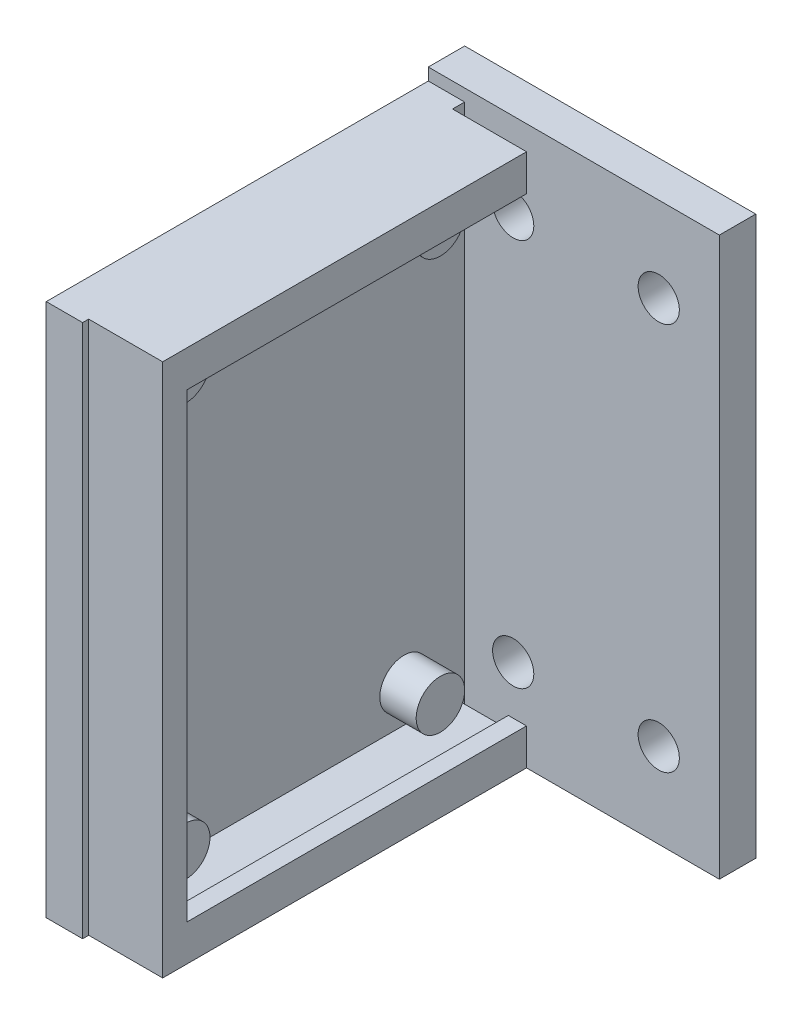
ISO-10303-21;
HEADER;
FILE_DESCRIPTION(('STEP AP214'),'2;1');
FILE_NAME('part.step','',(''),(''),'','','');
FILE_SCHEMA(('AUTOMOTIVE_DESIGN { 1 0 10303 214 1 1 1 1 }'));
ENDSEC;
DATA;
#1=APPLICATION_CONTEXT('core data for automotive mechanical design processes');
#2=APPLICATION_PROTOCOL_DEFINITION('international standard','automotive_design',2000,#1);
#3=PRODUCT_CONTEXT('',#1,'mechanical');
#4=PRODUCT('Part','Part','',(#3));
#5=PRODUCT_RELATED_PRODUCT_CATEGORY('part','',(#4));
#6=PRODUCT_DEFINITION_FORMATION('','',#4);
#7=PRODUCT_DEFINITION_CONTEXT('part definition',#1,'design');
#8=PRODUCT_DEFINITION('design','',#6,#7);
#9=PRODUCT_DEFINITION_SHAPE('','',#8);
#10=(LENGTH_UNIT() NAMED_UNIT(*) SI_UNIT(.MILLI.,.METRE.));
#11=(NAMED_UNIT(*) PLANE_ANGLE_UNIT() SI_UNIT($,.RADIAN.));
#12=(NAMED_UNIT(*) SI_UNIT($,.STERADIAN.) SOLID_ANGLE_UNIT());
#13=UNCERTAINTY_MEASURE_WITH_UNIT(LENGTH_MEASURE(1.E-05),#10,'distance_accuracy_value','');
#14=(GEOMETRIC_REPRESENTATION_CONTEXT(3) GLOBAL_UNCERTAINTY_ASSIGNED_CONTEXT((#13)) GLOBAL_UNIT_ASSIGNED_CONTEXT((#10,
#11,#12)) REPRESENTATION_CONTEXT('',''));
#15=CARTESIAN_POINT('',(0.,0.,0.));
#16=DIRECTION('',(0.,0.,1.));
#17=DIRECTION('',(1.,0.,0.));
#18=AXIS2_PLACEMENT_3D('',#15,#16,#17);
#19=CARTESIAN_POINT('',(181.,-22.,146.));
#20=DIRECTION('',(-1.,0.,0.));
#21=DIRECTION('',(0.,0.,1.));
#22=AXIS2_PLACEMENT_3D('',#19,#20,#21);
#23=PLANE('',#22);
#24=DIRECTION('',(0.,-1.,0.));
#25=VECTOR('',#24,1.);
#26=CARTESIAN_POINT('',(181.,-20.,145.5));
#27=LINE('',#26,#25);
#28=CARTESIAN_POINT('',(181.,22.,145.5));
#29=VERTEX_POINT('',#28);
#30=CARTESIAN_POINT('',(181.,-22.,145.5));
#31=VERTEX_POINT('',#30);
#32=EDGE_CURVE('E266',#29,#31,#27,.T.);
#33=ORIENTED_EDGE('',*,*,#32,.F.);
#34=DIRECTION('',(0.,0.,-1.));
#35=VECTOR('',#34,1.);
#36=CARTESIAN_POINT('',(181.,22.,146.));
#37=LINE('',#36,#35);
#38=CARTESIAN_POINT('',(181.,22.,146.));
#39=VERTEX_POINT('',#38);
#40=EDGE_CURVE('E344',#39,#29,#37,.T.);
#41=ORIENTED_EDGE('',*,*,#40,.F.);
#42=DIRECTION('',(0.,1.,0.));
#43=VECTOR('',#42,1.);
#44=CARTESIAN_POINT('',(181.,-22.,146.));
#45=LINE('',#44,#43);
#46=CARTESIAN_POINT('',(181.,-22.,146.));
#47=VERTEX_POINT('',#46);
#48=EDGE_CURVE('E329',#47,#39,#45,.T.);
#49=ORIENTED_EDGE('',*,*,#48,.F.);
#50=DIRECTION('',(0.,0.,-1.));
#51=VECTOR('',#50,1.);
#52=CARTESIAN_POINT('',(181.,-22.,146.));
#53=LINE('',#52,#51);
#54=EDGE_CURVE('E349',#47,#31,#53,.T.);
#55=ORIENTED_EDGE('',*,*,#54,.T.);
#56=EDGE_LOOP('',(#33,#41,#49,#55));
#57=FACE_BOUND('',#56,.T.);
#58=ADVANCED_FACE('F41',(#57),#23,.F.);
#59=CARTESIAN_POINT('',(185.6,20.,145.5));
#60=DIRECTION('',(1.,0.,0.));
#61=DIRECTION('',(0.,0.,-1.));
#62=AXIS2_PLACEMENT_3D('',#59,#60,#61);
#63=PLANE('',#62);
#64=DIRECTION('',(0.,-1.,0.));
#65=VECTOR('',#64,1.);
#66=CARTESIAN_POINT('',(185.6,20.,143.5));
#67=LINE('',#66,#65);
#68=CARTESIAN_POINT('',(185.6,20.,143.5));
#69=VERTEX_POINT('',#68);
#70=CARTESIAN_POINT('',(185.6,19.,143.5));
#71=VERTEX_POINT('',#70);
#72=EDGE_CURVE('E265',#69,#71,#67,.T.);
#73=ORIENTED_EDGE('',*,*,#72,.F.);
#74=DIRECTION('',(0.,0.,-1.));
#75=VECTOR('',#74,1.);
#76=CARTESIAN_POINT('',(185.6,20.,145.5));
#77=LINE('',#76,#75);
#78=CARTESIAN_POINT('',(185.6,20.,115.5));
#79=VERTEX_POINT('',#78);
#80=EDGE_CURVE('E298',#69,#79,#77,.T.);
#81=ORIENTED_EDGE('',*,*,#80,.T.);
#82=DIRECTION('',(0.,-1.,0.));
#83=VECTOR('',#82,1.);
#84=CARTESIAN_POINT('',(185.6,20.,115.5));
#85=LINE('',#84,#83);
#86=CARTESIAN_POINT('',(185.6,19.,115.5));
#87=VERTEX_POINT('',#86);
#88=EDGE_CURVE('E314',#79,#87,#85,.T.);
#89=ORIENTED_EDGE('',*,*,#88,.T.);
#90=DIRECTION('',(0.,0.,-1.));
#91=VECTOR('',#90,1.);
#92=CARTESIAN_POINT('',(185.6,19.,145.5));
#93=LINE('',#92,#91);
#94=EDGE_CURVE('E296',#71,#87,#93,.T.);
#95=ORIENTED_EDGE('',*,*,#94,.F.);
#96=EDGE_LOOP('',(#73,#81,#89,#95));
#97=FACE_BOUND('',#96,.T.);
#98=ADVANCED_FACE('F422',(#97),#63,.F.);
#99=CARTESIAN_POINT('',(185.6,19.,145.5));
#100=DIRECTION('',(0.,1.,0.));
#101=DIRECTION('',(0.,0.,1.));
#102=AXIS2_PLACEMENT_3D('',#99,#100,#101);
#103=PLANE('',#102);
#104=DIRECTION('',(1.,0.,0.));
#105=VECTOR('',#104,1.);
#106=CARTESIAN_POINT('',(185.6,19.,143.5));
#107=LINE('',#106,#105);
#108=CARTESIAN_POINT('',(187.1,19.,143.5));
#109=VERTEX_POINT('',#108);
#110=EDGE_CURVE('E259',#71,#109,#107,.T.);
#111=ORIENTED_EDGE('',*,*,#110,.F.);
#112=ORIENTED_EDGE('',*,*,#94,.T.);
#113=DIRECTION('',(1.,0.,0.));
#114=VECTOR('',#113,1.);
#115=CARTESIAN_POINT('',(185.6,19.,115.5));
#116=LINE('',#115,#114);
#117=CARTESIAN_POINT('',(187.1,19.,115.5));
#118=VERTEX_POINT('',#117);
#119=EDGE_CURVE('E313',#87,#118,#116,.T.);
#120=ORIENTED_EDGE('',*,*,#119,.T.);
#121=DIRECTION('',(0.,0.,-1.));
#122=VECTOR('',#121,1.);
#123=CARTESIAN_POINT('',(187.1,19.,145.5));
#124=LINE('',#123,#122);
#125=EDGE_CURVE('E299',#109,#118,#124,.T.);
#126=ORIENTED_EDGE('',*,*,#125,.F.);
#127=EDGE_LOOP('',(#111,#112,#120,#126));
#128=FACE_BOUND('',#127,.T.);
#129=ADVANCED_FACE('F435',(#128),#103,.F.);
#130=CARTESIAN_POINT('',(187.1,-19.,145.5));
#131=DIRECTION('',(0.,-1.,0.));
#132=DIRECTION('',(0.,0.,-1.));
#133=AXIS2_PLACEMENT_3D('',#130,#131,#132);
#134=PLANE('',#133);
#135=DIRECTION('',(-1.,0.,0.));
#136=VECTOR('',#135,1.);
#137=CARTESIAN_POINT('',(187.1,-19.,143.5));
#138=LINE('',#137,#136);
#139=CARTESIAN_POINT('',(187.1,-19.,143.5));
#140=VERTEX_POINT('',#139);
#141=CARTESIAN_POINT('',(185.6,-19.,143.5));
#142=VERTEX_POINT('',#141);
#143=EDGE_CURVE('E201',#140,#142,#138,.T.);
#144=ORIENTED_EDGE('',*,*,#143,.F.);
#145=DIRECTION('',(0.,0.,-1.));
#146=VECTOR('',#145,1.);
#147=CARTESIAN_POINT('',(187.1,-19.,145.5));
#148=LINE('',#147,#146);
#149=CARTESIAN_POINT('',(187.1,-19.,115.5));
#150=VERTEX_POINT('',#149);
#151=EDGE_CURVE('E288',#140,#150,#148,.T.);
#152=ORIENTED_EDGE('',*,*,#151,.T.);
#153=DIRECTION('',(-1.,0.,0.));
#154=VECTOR('',#153,1.);
#155=CARTESIAN_POINT('',(187.1,-19.,115.5));
#156=LINE('',#155,#154);
#157=CARTESIAN_POINT('',(185.6,-19.,115.5));
#158=VERTEX_POINT('',#157);
#159=EDGE_CURVE('E285',#150,#158,#156,.T.);
#160=ORIENTED_EDGE('',*,*,#159,.T.);
#161=DIRECTION('',(0.,0.,-1.));
#162=VECTOR('',#161,1.);
#163=CARTESIAN_POINT('',(185.6,-19.,145.5));
#164=LINE('',#163,#162);
#165=EDGE_CURVE('E191',#142,#158,#164,.T.);
#166=ORIENTED_EDGE('',*,*,#165,.F.);
#167=EDGE_LOOP('',(#144,#152,#160,#166));
#168=FACE_BOUND('',#167,.T.);
#169=ADVANCED_FACE('F477',(#168),#134,.F.);
#170=CARTESIAN_POINT('',(185.6,-19.,145.5));
#171=DIRECTION('',(1.,0.,0.));
#172=DIRECTION('',(0.,0.,-1.));
#173=AXIS2_PLACEMENT_3D('',#170,#171,#172);
#174=PLANE('',#173);
#175=DIRECTION('',(0.,-1.,0.));
#176=VECTOR('',#175,1.);
#177=CARTESIAN_POINT('',(185.6,-19.,143.5));
#178=LINE('',#177,#176);
#179=CARTESIAN_POINT('',(185.6,-20.,143.5));
#180=VERTEX_POINT('',#179);
#181=EDGE_CURVE('E184',#142,#180,#178,.T.);
#182=ORIENTED_EDGE('',*,*,#181,.F.);
#183=ORIENTED_EDGE('',*,*,#165,.T.);
#184=DIRECTION('',(0.,-1.,0.));
#185=VECTOR('',#184,1.);
#186=CARTESIAN_POINT('',(185.6,-19.,115.5));
#187=LINE('',#186,#185);
#188=CARTESIAN_POINT('',(185.6,-20.,115.5));
#189=VERTEX_POINT('',#188);
#190=EDGE_CURVE('E190',#158,#189,#187,.T.);
#191=ORIENTED_EDGE('',*,*,#190,.T.);
#192=DIRECTION('',(0.,0.,-1.));
#193=VECTOR('',#192,1.);
#194=CARTESIAN_POINT('',(185.6,-20.,145.5));
#195=LINE('',#194,#193);
#196=EDGE_CURVE('E179',#180,#189,#195,.T.);
#197=ORIENTED_EDGE('',*,*,#196,.F.);
#198=EDGE_LOOP('',(#182,#183,#191,#197));
#199=FACE_BOUND('',#198,.T.);
#200=ADVANCED_FACE('F185',(#199),#174,.F.);
#201=CARTESIAN_POINT('',(178.,23.,114.5));
#202=DIRECTION('',(1.,0.,0.));
#203=DIRECTION('',(0.,0.,-1.));
#204=AXIS2_PLACEMENT_3D('',#201,#202,#203);
#205=PLANE('',#204);
#206=DIRECTION('',(0.,-1.,0.));
#207=VECTOR('',#206,1.);
#208=CARTESIAN_POINT('',(178.,23.,111.5));
#209=LINE('',#208,#207);
#210=CARTESIAN_POINT('',(178.,23.,111.5));
#211=VERTEX_POINT('',#210);
#212=CARTESIAN_POINT('',(178.,-23.,111.5));
#213=VERTEX_POINT('',#212);
#214=EDGE_CURVE('E352',#211,#213,#209,.T.);
#215=ORIENTED_EDGE('',*,*,#214,.T.);
#216=DIRECTION('',(0.,0.,-1.));
#217=VECTOR('',#216,1.);
#218=CARTESIAN_POINT('',(178.,-23.,114.5));
#219=LINE('',#218,#217);
#220=CARTESIAN_POINT('',(178.,-23.,114.5));
#221=VERTEX_POINT('',#220);
#222=EDGE_CURVE('E202',#221,#213,#219,.T.);
#223=ORIENTED_EDGE('',*,*,#222,.F.);
#224=DIRECTION('',(0.,-1.,0.));
#225=VECTOR('',#224,1.);
#226=CARTESIAN_POINT('',(178.,23.,114.5));
#227=LINE('',#226,#225);
#228=CARTESIAN_POINT('',(178.,-22.,114.5));
#229=VERTEX_POINT('',#228);
#230=EDGE_CURVE('E357',#229,#221,#227,.T.);
#231=ORIENTED_EDGE('',*,*,#230,.F.);
#232=DIRECTION('',(0.,0.,-1.));
#233=VECTOR('',#232,1.);
#234=CARTESIAN_POINT('',(178.,-22.,146.));
#235=LINE('',#234,#233);
#236=CARTESIAN_POINT('',(178.,-22.,146.));
#237=VERTEX_POINT('',#236);
#238=EDGE_CURVE('E353',#237,#229,#235,.T.);
#239=ORIENTED_EDGE('',*,*,#238,.F.);
#240=DIRECTION('',(0.,-1.,0.));
#241=VECTOR('',#240,1.);
#242=CARTESIAN_POINT('',(178.,22.,146.));
#243=LINE('',#242,#241);
#244=CARTESIAN_POINT('',(178.,22.,146.));
#245=VERTEX_POINT('',#244);
#246=EDGE_CURVE('E322',#245,#237,#243,.T.);
#247=ORIENTED_EDGE('',*,*,#246,.F.);
#248=DIRECTION('',(0.,0.,-1.));
#249=VECTOR('',#248,1.);
#250=CARTESIAN_POINT('',(178.,22.,146.));
#251=LINE('',#250,#249);
#252=CARTESIAN_POINT('',(178.,22.,114.5));
#253=VERTEX_POINT('',#252);
#254=EDGE_CURVE('E331',#245,#253,#251,.T.);
#255=ORIENTED_EDGE('',*,*,#254,.T.);
#256=CARTESIAN_POINT('',(178.,23.,114.5));
#257=VERTEX_POINT('',#256);
#258=EDGE_CURVE('E354',#257,#253,#227,.T.);
#259=ORIENTED_EDGE('',*,*,#258,.F.);
#260=DIRECTION('',(0.,0.,-1.));
#261=VECTOR('',#260,1.);
#262=CARTESIAN_POINT('',(178.,23.,114.5));
#263=LINE('',#262,#261);
#264=EDGE_CURVE('E365',#257,#211,#263,.T.);
#265=ORIENTED_EDGE('',*,*,#264,.T.);
#266=EDGE_LOOP('',(#215,#223,#231,#239,#247,#255,#259,#265));
#267=FACE_BOUND('',#266,.T.);
#268=ADVANCED_FACE('F43',(#267),#205,.F.);
#269=CARTESIAN_POINT('',(178.,-23.,114.5));
#270=DIRECTION('',(0.,1.,0.));
#271=DIRECTION('',(0.,0.,1.));
#272=AXIS2_PLACEMENT_3D('',#269,#270,#271);
#273=PLANE('',#272);
#274=DIRECTION('',(1.,0.,0.));
#275=VECTOR('',#274,1.);
#276=CARTESIAN_POINT('',(178.,-23.,111.5));
#277=LINE('',#276,#275);
#278=CARTESIAN_POINT('',(202.,-23.,111.5));
#279=VERTEX_POINT('',#278);
#280=EDGE_CURVE('E370',#213,#279,#277,.T.);
#281=ORIENTED_EDGE('',*,*,#280,.T.);
#282=DIRECTION('',(0.,0.,-1.));
#283=VECTOR('',#282,1.);
#284=CARTESIAN_POINT('',(202.,-23.,114.5));
#285=LINE('',#284,#283);
#286=CARTESIAN_POINT('',(202.,-23.,114.5));
#287=VERTEX_POINT('',#286);
#288=EDGE_CURVE('E211',#287,#279,#285,.T.);
#289=ORIENTED_EDGE('',*,*,#288,.F.);
#290=DIRECTION('',(1.,0.,0.));
#291=VECTOR('',#290,1.);
#292=CARTESIAN_POINT('',(178.,-23.,114.5));
#293=LINE('',#292,#291);
#294=EDGE_CURVE('E360',#221,#287,#293,.T.);
#295=ORIENTED_EDGE('',*,*,#294,.F.);
#296=ORIENTED_EDGE('',*,*,#222,.T.);
#297=EDGE_LOOP('',(#281,#289,#295,#296));
#298=FACE_BOUND('',#297,.T.);
#299=ADVANCED_FACE('F417',(#298),#273,.F.);
#300=CARTESIAN_POINT('',(202.,-23.,114.5));
#301=DIRECTION('',(-1.,0.,0.));
#302=DIRECTION('',(0.,0.,1.));
#303=AXIS2_PLACEMENT_3D('',#300,#301,#302);
#304=PLANE('',#303);
#305=DIRECTION('',(0.,1.,0.));
#306=VECTOR('',#305,1.);
#307=CARTESIAN_POINT('',(202.,-23.,111.5));
#308=LINE('',#307,#306);
#309=CARTESIAN_POINT('',(202.,23.,111.5));
#310=VERTEX_POINT('',#309);
#311=EDGE_CURVE('E369',#279,#310,#308,.T.);
#312=ORIENTED_EDGE('',*,*,#311,.T.);
#313=DIRECTION('',(0.,0.,-1.));
#314=VECTOR('',#313,1.);
#315=CARTESIAN_POINT('',(202.,23.,114.5));
#316=LINE('',#315,#314);
#317=CARTESIAN_POINT('',(202.,23.,114.5));
#318=VERTEX_POINT('',#317);
#319=EDGE_CURVE('E374',#318,#310,#316,.T.);
#320=ORIENTED_EDGE('',*,*,#319,.F.);
#321=DIRECTION('',(0.,1.,0.));
#322=VECTOR('',#321,1.);
#323=CARTESIAN_POINT('',(202.,-23.,114.5));
#324=LINE('',#323,#322);
#325=EDGE_CURVE('E359',#287,#318,#324,.T.);
#326=ORIENTED_EDGE('',*,*,#325,.F.);
#327=ORIENTED_EDGE('',*,*,#288,.T.);
#328=EDGE_LOOP('',(#312,#320,#326,#327));
#329=FACE_BOUND('',#328,.T.);
#330=ADVANCED_FACE('F385',(#329),#304,.F.);
#331=CARTESIAN_POINT('',(202.,23.,114.5));
#332=DIRECTION('',(0.,-1.,0.));
#333=DIRECTION('',(0.,0.,-1.));
#334=AXIS2_PLACEMENT_3D('',#331,#332,#333);
#335=PLANE('',#334);
#336=DIRECTION('',(-1.,0.,0.));
#337=VECTOR('',#336,1.);
#338=CARTESIAN_POINT('',(202.,23.,111.5));
#339=LINE('',#338,#337);
#340=EDGE_CURVE('E371',#310,#211,#339,.T.);
#341=ORIENTED_EDGE('',*,*,#340,.T.);
#342=ORIENTED_EDGE('',*,*,#264,.F.);
#343=DIRECTION('',(-1.,0.,0.));
#344=VECTOR('',#343,1.);
#345=CARTESIAN_POINT('',(202.,23.,114.5));
#346=LINE('',#345,#344);
#347=EDGE_CURVE('E362',#318,#257,#346,.T.);
#348=ORIENTED_EDGE('',*,*,#347,.F.);
#349=ORIENTED_EDGE('',*,*,#319,.T.);
#350=EDGE_LOOP('',(#341,#342,#348,#349));
#351=FACE_BOUND('',#350,.T.);
#352=ADVANCED_FACE('F395',(#351),#335,.F.);
#353=CARTESIAN_POINT('',(0.,0.,114.5));
#354=DIRECTION('',(0.,0.,1.));
#355=DIRECTION('',(1.,0.,0.));
#356=AXIS2_PLACEMENT_3D('',#353,#354,#355);
#357=PLANE('',#356);
#358=CARTESIAN_POINT('',(185.,16.,114.5));
#359=DIRECTION('',(0.,0.,1.));
#360=DIRECTION('',(1.,0.,0.));
#361=AXIS2_PLACEMENT_3D('',#358,#359,#360);
#362=CIRCLE('',#361,1.70000000000001);
#363=CARTESIAN_POINT('',(186.7,16.,114.5));
#364=VERTEX_POINT('',#363);
#365=EDGE_CURVE('E239',#364,#364,#362,.F.);
#366=ORIENTED_EDGE('',*,*,#365,.T.);
#367=EDGE_LOOP('',(#366));
#368=FACE_BOUND('',#367,.T.);
#369=CARTESIAN_POINT('',(197.,-16.,114.5));
#370=DIRECTION('',(0.,0.,1.));
#371=DIRECTION('',(1.,0.,0.));
#372=AXIS2_PLACEMENT_3D('',#369,#370,#371);
#373=CIRCLE('',#372,1.70000000000001);
#374=CARTESIAN_POINT('',(198.7,-16.,114.5));
#375=VERTEX_POINT('',#374);
#376=EDGE_CURVE('E226',#375,#375,#373,.F.);
#377=ORIENTED_EDGE('',*,*,#376,.T.);
#378=EDGE_LOOP('',(#377));
#379=FACE_BOUND('',#378,.T.);
#380=CARTESIAN_POINT('',(197.,16.,114.5));
#381=DIRECTION('',(0.,0.,1.));
#382=DIRECTION('',(1.,0.,0.));
#383=AXIS2_PLACEMENT_3D('',#380,#381,#382);
#384=CIRCLE('',#383,1.70000000000001);
#385=CARTESIAN_POINT('',(198.7,16.,114.5));
#386=VERTEX_POINT('',#385);
#387=EDGE_CURVE('E223',#386,#386,#384,.F.);
#388=ORIENTED_EDGE('',*,*,#387,.T.);
#389=EDGE_LOOP('',(#388));
#390=FACE_BOUND('',#389,.T.);
#391=CARTESIAN_POINT('',(185.,-16.,114.5));
#392=DIRECTION('',(0.,0.,1.));
#393=DIRECTION('',(1.,0.,0.));
#394=AXIS2_PLACEMENT_3D('',#391,#392,#393);
#395=CIRCLE('',#394,1.70000000000001);
#396=CARTESIAN_POINT('',(186.7,-16.,114.5));
#397=VERTEX_POINT('',#396);
#398=EDGE_CURVE('E225',#397,#397,#395,.F.);
#399=ORIENTED_EDGE('',*,*,#398,.T.);
#400=EDGE_LOOP('',(#399));
#401=FACE_BOUND('',#400,.T.);
#402=DIRECTION('',(-1.,0.,0.));
#403=VECTOR('',#402,1.);
#404=CARTESIAN_POINT('',(181.,22.,114.5));
#405=LINE('',#404,#403);
#406=CARTESIAN_POINT('',(181.,22.,114.5));
#407=VERTEX_POINT('',#406);
#408=EDGE_CURVE('E327',#407,#253,#405,.T.);
#409=ORIENTED_EDGE('',*,*,#408,.F.);
#410=DIRECTION('',(0.,1.,0.));
#411=VECTOR('',#410,1.);
#412=CARTESIAN_POINT('',(181.,-22.,114.5));
#413=LINE('',#412,#411);
#414=CARTESIAN_POINT('',(181.,-22.,114.5));
#415=VERTEX_POINT('',#414);
#416=EDGE_CURVE('E340',#415,#407,#413,.T.);
#417=ORIENTED_EDGE('',*,*,#416,.F.);
#418=DIRECTION('',(1.,0.,0.));
#419=VECTOR('',#418,1.);
#420=CARTESIAN_POINT('',(178.,-22.,114.5));
#421=LINE('',#420,#419);
#422=EDGE_CURVE('E294',#229,#415,#421,.T.);
#423=ORIENTED_EDGE('',*,*,#422,.F.);
#424=ORIENTED_EDGE('',*,*,#230,.T.);
#425=ORIENTED_EDGE('',*,*,#294,.T.);
#426=ORIENTED_EDGE('',*,*,#325,.T.);
#427=ORIENTED_EDGE('',*,*,#347,.T.);
#428=ORIENTED_EDGE('',*,*,#258,.T.);
#429=EDGE_LOOP('',(#409,#417,#423,#424,#425,#426,#427,#428));
#430=FACE_BOUND('',#429,.T.);
#431=ADVANCED_FACE('F402',(#368,#379,#390,#401,#430),#357,.T.);
#432=CARTESIAN_POINT('',(0.,0.,111.5));
#433=DIRECTION('',(0.,0.,1.));
#434=DIRECTION('',(1.,0.,0.));
#435=AXIS2_PLACEMENT_3D('',#432,#433,#434);
#436=PLANE('',#435);
#437=CARTESIAN_POINT('',(185.,16.,111.5));
#438=DIRECTION('',(0.,0.,1.));
#439=DIRECTION('',(1.,0.,0.));
#440=AXIS2_PLACEMENT_3D('',#437,#438,#439);
#441=CIRCLE('',#440,1.70000000000001);
#442=CARTESIAN_POINT('',(186.7,16.,111.5));
#443=VERTEX_POINT('',#442);
#444=EDGE_CURVE('E44',#443,#443,#441,.F.);
#445=ORIENTED_EDGE('',*,*,#444,.F.);
#446=EDGE_LOOP('',(#445));
#447=FACE_BOUND('',#446,.T.);
#448=CARTESIAN_POINT('',(197.,-16.,111.5));
#449=DIRECTION('',(0.,0.,1.));
#450=DIRECTION('',(1.,0.,0.));
#451=AXIS2_PLACEMENT_3D('',#448,#449,#450);
#452=CIRCLE('',#451,1.70000000000001);
#453=CARTESIAN_POINT('',(198.7,-16.,111.5));
#454=VERTEX_POINT('',#453);
#455=EDGE_CURVE('E228',#454,#454,#452,.F.);
#456=ORIENTED_EDGE('',*,*,#455,.F.);
#457=EDGE_LOOP('',(#456));
#458=FACE_BOUND('',#457,.T.);
#459=CARTESIAN_POINT('',(197.,16.,111.5));
#460=DIRECTION('',(0.,0.,1.));
#461=DIRECTION('',(1.,0.,0.));
#462=AXIS2_PLACEMENT_3D('',#459,#460,#461);
#463=CIRCLE('',#462,1.70000000000001);
#464=CARTESIAN_POINT('',(198.7,16.,111.5));
#465=VERTEX_POINT('',#464);
#466=EDGE_CURVE('E224',#465,#465,#463,.F.);
#467=ORIENTED_EDGE('',*,*,#466,.F.);
#468=EDGE_LOOP('',(#467));
#469=FACE_BOUND('',#468,.T.);
#470=CARTESIAN_POINT('',(185.,-16.,111.5));
#471=DIRECTION('',(0.,0.,1.));
#472=DIRECTION('',(1.,0.,0.));
#473=AXIS2_PLACEMENT_3D('',#470,#471,#472);
#474=CIRCLE('',#473,1.70000000000001);
#475=CARTESIAN_POINT('',(186.7,-16.,111.5));
#476=VERTEX_POINT('',#475);
#477=EDGE_CURVE('E218',#476,#476,#474,.F.);
#478=ORIENTED_EDGE('',*,*,#477,.F.);
#479=EDGE_LOOP('',(#478));
#480=FACE_BOUND('',#479,.T.);
#481=ORIENTED_EDGE('',*,*,#214,.F.);
#482=ORIENTED_EDGE('',*,*,#340,.F.);
#483=ORIENTED_EDGE('',*,*,#311,.F.);
#484=ORIENTED_EDGE('',*,*,#280,.F.);
#485=EDGE_LOOP('',(#481,#482,#483,#484));
#486=FACE_BOUND('',#485,.T.);
#487=ADVANCED_FACE('F386',(#447,#458,#469,#480,#486),#436,.F.);
#488=CARTESIAN_POINT('',(178.,-22.,146.));
#489=DIRECTION('',(0.,1.,0.));
#490=DIRECTION('',(0.,0.,1.));
#491=AXIS2_PLACEMENT_3D('',#488,#489,#490);
#492=PLANE('',#491);
#493=ORIENTED_EDGE('',*,*,#422,.T.);
#494=CARTESIAN_POINT('',(181.,-22.,115.5));
#495=VERTEX_POINT('',#494);
#496=EDGE_CURVE('E346',#495,#415,#53,.T.);
#497=ORIENTED_EDGE('',*,*,#496,.F.);
#498=DIRECTION('',(1.,0.,0.));
#499=VECTOR('',#498,1.);
#500=CARTESIAN_POINT('',(181.,-22.,115.5));
#501=LINE('',#500,#499);
#502=CARTESIAN_POINT('',(187.1,-22.,115.5));
#503=VERTEX_POINT('',#502);
#504=EDGE_CURVE('E277',#495,#503,#501,.T.);
#505=ORIENTED_EDGE('',*,*,#504,.T.);
#506=DIRECTION('',(0.,0.,-1.));
#507=VECTOR('',#506,1.);
#508=CARTESIAN_POINT('',(187.1,-22.,145.5));
#509=LINE('',#508,#507);
#510=CARTESIAN_POINT('',(187.1,-22.,145.5));
#511=VERTEX_POINT('',#510);
#512=EDGE_CURVE('E292',#511,#503,#509,.T.);
#513=ORIENTED_EDGE('',*,*,#512,.F.);
#514=DIRECTION('',(1.,0.,0.));
#515=VECTOR('',#514,1.);
#516=CARTESIAN_POINT('',(181.,-22.,145.5));
#517=LINE('',#516,#515);
#518=EDGE_CURVE('E267',#31,#511,#517,.T.);
#519=ORIENTED_EDGE('',*,*,#518,.F.);
#520=ORIENTED_EDGE('',*,*,#54,.F.);
#521=DIRECTION('',(1.,0.,0.));
#522=VECTOR('',#521,1.);
#523=CARTESIAN_POINT('',(178.,-22.,146.));
#524=LINE('',#523,#522);
#525=EDGE_CURVE('E330',#237,#47,#524,.T.);
#526=ORIENTED_EDGE('',*,*,#525,.F.);
#527=ORIENTED_EDGE('',*,*,#238,.T.);
#528=EDGE_LOOP('',(#493,#497,#505,#513,#519,#520,#526,#527));
#529=FACE_BOUND('',#528,.T.);
#530=ADVANCED_FACE('F412',(#529),#492,.F.);
#531=CARTESIAN_POINT('',(181.,-17.,140.5));
#532=DIRECTION('',(-1.,0.,0.));
#533=DIRECTION('',(0.,0.,1.));
#534=AXIS2_PLACEMENT_3D('',#531,#532,#533);
#535=CIRCLE('',#534,2.);
#536=CARTESIAN_POINT('',(181.,-17.,142.5));
#537=VERTEX_POINT('',#536);
#538=EDGE_CURVE('E11',#537,#537,#535,.F.);
#539=ORIENTED_EDGE('',*,*,#538,.F.);
#540=EDGE_LOOP('',(#539));
#541=FACE_BOUND('',#540,.T.);
#542=CARTESIAN_POINT('',(181.,17.,119.5));
#543=DIRECTION('',(-1.,0.,0.));
#544=DIRECTION('',(0.,0.,1.));
#545=AXIS2_PLACEMENT_3D('',#542,#543,#544);
#546=CIRCLE('',#545,2.);
#547=CARTESIAN_POINT('',(181.,17.,121.5));
#548=VERTEX_POINT('',#547);
#549=EDGE_CURVE('E49',#548,#548,#546,.F.);
#550=ORIENTED_EDGE('',*,*,#549,.F.);
#551=EDGE_LOOP('',(#550));
#552=FACE_BOUND('',#551,.T.);
#553=CARTESIAN_POINT('',(181.,17.,140.5));
#554=DIRECTION('',(-1.,0.,0.));
#555=DIRECTION('',(0.,0.,1.));
#556=AXIS2_PLACEMENT_3D('',#553,#554,#555);
#557=CIRCLE('',#556,2.);
#558=CARTESIAN_POINT('',(181.,17.,142.5));
#559=VERTEX_POINT('',#558);
#560=EDGE_CURVE('E208',#559,#559,#557,.F.);
#561=ORIENTED_EDGE('',*,*,#560,.F.);
#562=EDGE_LOOP('',(#561));
#563=FACE_BOUND('',#562,.T.);
#564=CARTESIAN_POINT('',(181.,-17.,119.5));
#565=DIRECTION('',(-1.,0.,0.));
#566=DIRECTION('',(0.,0.,1.));
#567=AXIS2_PLACEMENT_3D('',#564,#565,#566);
#568=CIRCLE('',#567,2.);
#569=CARTESIAN_POINT('',(181.,-17.,121.5));
#570=VERTEX_POINT('',#569);
#571=EDGE_CURVE('E204',#570,#570,#568,.F.);
#572=ORIENTED_EDGE('',*,*,#571,.F.);
#573=EDGE_LOOP('',(#572));
#574=FACE_BOUND('',#573,.T.);
#575=DIRECTION('',(0.,0.,-1.));
#576=VECTOR('',#575,1.);
#577=CARTESIAN_POINT('',(181.,20.,145.5));
#578=LINE('',#577,#576);
#579=CARTESIAN_POINT('',(181.,20.,143.5));
#580=VERTEX_POINT('',#579);
#581=CARTESIAN_POINT('',(181.,20.,115.5));
#582=VERTEX_POINT('',#581);
#583=EDGE_CURVE('E264',#580,#582,#578,.T.);
#584=ORIENTED_EDGE('',*,*,#583,.F.);
#585=DIRECTION('',(0.,-1.,0.));
#586=VECTOR('',#585,1.);
#587=CARTESIAN_POINT('',(181.,20.,143.5));
#588=LINE('',#587,#586);
#589=CARTESIAN_POINT('',(181.,-20.,143.5));
#590=VERTEX_POINT('',#589);
#591=EDGE_CURVE('E64',#580,#590,#588,.T.);
#592=ORIENTED_EDGE('',*,*,#591,.T.);
#593=DIRECTION('',(0.,0.,-1.));
#594=VECTOR('',#593,1.);
#595=CARTESIAN_POINT('',(181.,-20.,145.5));
#596=LINE('',#595,#594);
#597=CARTESIAN_POINT('',(181.,-20.,115.5));
#598=VERTEX_POINT('',#597);
#599=EDGE_CURVE('E195',#590,#598,#596,.T.);
#600=ORIENTED_EDGE('',*,*,#599,.T.);
#601=DIRECTION('',(0.,-1.,0.));
#602=VECTOR('',#601,1.);
#603=CARTESIAN_POINT('',(181.,-20.,115.5));
#604=LINE('',#603,#602);
#605=EDGE_CURVE('E273',#598,#495,#604,.T.);
#606=ORIENTED_EDGE('',*,*,#605,.T.);
#607=ORIENTED_EDGE('',*,*,#496,.T.);
#608=ORIENTED_EDGE('',*,*,#416,.T.);
#609=CARTESIAN_POINT('',(181.,22.,115.5));
#610=VERTEX_POINT('',#609);
#611=EDGE_CURVE('E343',#610,#407,#37,.T.);
#612=ORIENTED_EDGE('',*,*,#611,.F.);
#613=DIRECTION('',(0.,-1.,0.));
#614=VECTOR('',#613,1.);
#615=CARTESIAN_POINT('',(181.,22.,115.5));
#616=LINE('',#615,#614);
#617=EDGE_CURVE('E280',#610,#582,#616,.T.);
#618=ORIENTED_EDGE('',*,*,#617,.T.);
#619=EDGE_LOOP('',(#584,#592,#600,#606,#607,#608,#612,#618));
#620=FACE_BOUND('',#619,.T.);
#621=ADVANCED_FACE('F406',(#541,#552,#563,#574,#620),#23,.F.);
#622=CARTESIAN_POINT('',(181.,22.,146.));
#623=DIRECTION('',(0.,-1.,0.));
#624=DIRECTION('',(0.,0.,-1.));
#625=AXIS2_PLACEMENT_3D('',#622,#623,#624);
#626=PLANE('',#625);
#627=ORIENTED_EDGE('',*,*,#408,.T.);
#628=ORIENTED_EDGE('',*,*,#254,.F.);
#629=DIRECTION('',(-1.,0.,0.));
#630=VECTOR('',#629,1.);
#631=CARTESIAN_POINT('',(181.,22.,146.));
#632=LINE('',#631,#630);
#633=EDGE_CURVE('E335',#39,#245,#632,.T.);
#634=ORIENTED_EDGE('',*,*,#633,.F.);
#635=ORIENTED_EDGE('',*,*,#40,.T.);
#636=DIRECTION('',(-1.,0.,0.));
#637=VECTOR('',#636,1.);
#638=CARTESIAN_POINT('',(187.1,22.,145.5));
#639=LINE('',#638,#637);
#640=CARTESIAN_POINT('',(187.1,22.,145.5));
#641=VERTEX_POINT('',#640);
#642=EDGE_CURVE('E304',#641,#29,#639,.T.);
#643=ORIENTED_EDGE('',*,*,#642,.F.);
#644=DIRECTION('',(0.,0.,-1.));
#645=VECTOR('',#644,1.);
#646=CARTESIAN_POINT('',(187.1,22.,145.5));
#647=LINE('',#646,#645);
#648=CARTESIAN_POINT('',(187.1,22.,115.5));
#649=VERTEX_POINT('',#648);
#650=EDGE_CURVE('E305',#641,#649,#647,.T.);
#651=ORIENTED_EDGE('',*,*,#650,.T.);
#652=DIRECTION('',(-1.,0.,0.));
#653=VECTOR('',#652,1.);
#654=CARTESIAN_POINT('',(187.1,22.,115.5));
#655=LINE('',#654,#653);
#656=EDGE_CURVE('E308',#649,#610,#655,.T.);
#657=ORIENTED_EDGE('',*,*,#656,.T.);
#658=ORIENTED_EDGE('',*,*,#611,.T.);
#659=EDGE_LOOP('',(#627,#628,#634,#635,#643,#651,#657,#658));
#660=FACE_BOUND('',#659,.T.);
#661=ADVANCED_FACE('F404',(#660),#626,.F.);
#662=CARTESIAN_POINT('',(0.,0.,146.));
#663=DIRECTION('',(0.,0.,1.));
#664=DIRECTION('',(1.,0.,0.));
#665=AXIS2_PLACEMENT_3D('',#662,#663,#664);
#666=PLANE('',#665);
#667=ORIENTED_EDGE('',*,*,#246,.T.);
#668=ORIENTED_EDGE('',*,*,#525,.T.);
#669=ORIENTED_EDGE('',*,*,#48,.T.);
#670=ORIENTED_EDGE('',*,*,#633,.T.);
#671=EDGE_LOOP('',(#667,#668,#669,#670));
#672=FACE_BOUND('',#671,.T.);
#673=ADVANCED_FACE('F441',(#672),#666,.T.);
#674=CARTESIAN_POINT('',(181.,20.,145.5));
#675=DIRECTION('',(0.,1.,0.));
#676=DIRECTION('',(0.,0.,1.));
#677=AXIS2_PLACEMENT_3D('',#674,#675,#676);
#678=PLANE('',#677);
#679=ORIENTED_EDGE('',*,*,#80,.F.);
#680=DIRECTION('',(-1.,0.,0.));
#681=VECTOR('',#680,1.);
#682=CARTESIAN_POINT('',(187.1,20.,143.5));
#683=LINE('',#682,#681);
#684=EDGE_CURVE('E59',#69,#580,#683,.T.);
#685=ORIENTED_EDGE('',*,*,#684,.T.);
#686=ORIENTED_EDGE('',*,*,#583,.T.);
#687=DIRECTION('',(1.,0.,0.));
#688=VECTOR('',#687,1.);
#689=CARTESIAN_POINT('',(181.,20.,115.5));
#690=LINE('',#689,#688);
#691=EDGE_CURVE('E320',#582,#79,#690,.T.);
#692=ORIENTED_EDGE('',*,*,#691,.T.);
#693=EDGE_LOOP('',(#679,#685,#686,#692));
#694=FACE_BOUND('',#693,.T.);
#695=ADVANCED_FACE('F488',(#694),#678,.F.);
#696=CARTESIAN_POINT('',(0.,0.,115.5));
#697=DIRECTION('',(0.,0.,1.));
#698=DIRECTION('',(1.,0.,0.));
#699=AXIS2_PLACEMENT_3D('',#696,#697,#698);
#700=PLANE('',#699);
#701=ORIENTED_EDGE('',*,*,#617,.F.);
#702=ORIENTED_EDGE('',*,*,#656,.F.);
#703=DIRECTION('',(0.,1.,0.));
#704=VECTOR('',#703,1.);
#705=CARTESIAN_POINT('',(187.1,19.,115.5));
#706=LINE('',#705,#704);
#707=EDGE_CURVE('E310',#118,#649,#706,.T.);
#708=ORIENTED_EDGE('',*,*,#707,.F.);
#709=ORIENTED_EDGE('',*,*,#119,.F.);
#710=ORIENTED_EDGE('',*,*,#88,.F.);
#711=ORIENTED_EDGE('',*,*,#691,.F.);
#712=EDGE_LOOP('',(#701,#702,#708,#709,#710,#711));
#713=FACE_BOUND('',#712,.T.);
#714=ADVANCED_FACE('F486',(#713),#700,.F.);
#715=CARTESIAN_POINT('',(187.1,-22.,145.5));
#716=DIRECTION('',(-1.,0.,0.));
#717=DIRECTION('',(0.,0.,1.));
#718=AXIS2_PLACEMENT_3D('',#715,#716,#717);
#719=PLANE('',#718);
#720=ORIENTED_EDGE('',*,*,#151,.F.);
#721=DIRECTION('',(0.,1.,0.));
#722=VECTOR('',#721,1.);
#723=CARTESIAN_POINT('',(187.1,-20.,143.5));
#724=LINE('',#723,#722);
#725=EDGE_CURVE('E196',#140,#109,#724,.T.);
#726=ORIENTED_EDGE('',*,*,#725,.T.);
#727=ORIENTED_EDGE('',*,*,#125,.T.);
#728=ORIENTED_EDGE('',*,*,#707,.T.);
#729=ORIENTED_EDGE('',*,*,#650,.F.);
#730=DIRECTION('',(0.,1.,0.));
#731=VECTOR('',#730,1.);
#732=CARTESIAN_POINT('',(187.1,-22.,145.5));
#733=LINE('',#732,#731);
#734=EDGE_CURVE('E275',#511,#641,#733,.T.);
#735=ORIENTED_EDGE('',*,*,#734,.F.);
#736=ORIENTED_EDGE('',*,*,#512,.T.);
#737=DIRECTION('',(0.,1.,0.));
#738=VECTOR('',#737,1.);
#739=CARTESIAN_POINT('',(187.1,-22.,115.5));
#740=LINE('',#739,#738);
#741=EDGE_CURVE('E276',#503,#150,#740,.T.);
#742=ORIENTED_EDGE('',*,*,#741,.T.);
#743=EDGE_LOOP('',(#720,#726,#727,#728,#729,#735,#736,#742));
#744=FACE_BOUND('',#743,.T.);
#745=ADVANCED_FACE('F480',(#744),#719,.F.);
#746=CARTESIAN_POINT('',(185.6,-20.,145.5));
#747=DIRECTION('',(0.,-1.,0.));
#748=DIRECTION('',(0.,0.,-1.));
#749=AXIS2_PLACEMENT_3D('',#746,#747,#748);
#750=PLANE('',#749);
#751=ORIENTED_EDGE('',*,*,#599,.F.);
#752=DIRECTION('',(1.,0.,0.));
#753=VECTOR('',#752,1.);
#754=CARTESIAN_POINT('',(181.,-20.,143.5));
#755=LINE('',#754,#753);
#756=EDGE_CURVE('E194',#590,#180,#755,.T.);
#757=ORIENTED_EDGE('',*,*,#756,.T.);
#758=ORIENTED_EDGE('',*,*,#196,.T.);
#759=DIRECTION('',(-1.,0.,0.));
#760=VECTOR('',#759,1.);
#761=CARTESIAN_POINT('',(185.6,-20.,115.5));
#762=LINE('',#761,#760);
#763=EDGE_CURVE('E269',#189,#598,#762,.T.);
#764=ORIENTED_EDGE('',*,*,#763,.T.);
#765=EDGE_LOOP('',(#751,#757,#758,#764));
#766=FACE_BOUND('',#765,.T.);
#767=ADVANCED_FACE('F198',(#766),#750,.F.);
#768=CARTESIAN_POINT('',(0.,0.,145.5));
#769=DIRECTION('',(0.,0.,1.));
#770=DIRECTION('',(1.,0.,0.));
#771=AXIS2_PLACEMENT_3D('',#768,#769,#770);
#772=PLANE('',#771);
#773=ORIENTED_EDGE('',*,*,#734,.T.);
#774=ORIENTED_EDGE('',*,*,#642,.T.);
#775=ORIENTED_EDGE('',*,*,#32,.T.);
#776=ORIENTED_EDGE('',*,*,#518,.T.);
#777=EDGE_LOOP('',(#773,#774,#775,#776));
#778=FACE_BOUND('',#777,.T.);
#779=ADVANCED_FACE('F468',(#778),#772,.T.);
#780=CARTESIAN_POINT('',(0.,0.,115.5));
#781=DIRECTION('',(0.,0.,1.));
#782=DIRECTION('',(1.,0.,0.));
#783=AXIS2_PLACEMENT_3D('',#780,#781,#782);
#784=PLANE('',#783);
#785=ORIENTED_EDGE('',*,*,#605,.F.);
#786=ORIENTED_EDGE('',*,*,#763,.F.);
#787=ORIENTED_EDGE('',*,*,#190,.F.);
#788=ORIENTED_EDGE('',*,*,#159,.F.);
#789=ORIENTED_EDGE('',*,*,#741,.F.);
#790=ORIENTED_EDGE('',*,*,#504,.F.);
#791=EDGE_LOOP('',(#785,#786,#787,#788,#789,#790));
#792=FACE_BOUND('',#791,.T.);
#793=ADVANCED_FACE('F462',(#792),#784,.F.);
#794=CARTESIAN_POINT('',(0.,0.,143.5));
#795=DIRECTION('',(0.,0.,1.));
#796=DIRECTION('',(1.,0.,0.));
#797=AXIS2_PLACEMENT_3D('',#794,#795,#796);
#798=PLANE('',#797);
#799=ORIENTED_EDGE('',*,*,#684,.F.);
#800=ORIENTED_EDGE('',*,*,#72,.T.);
#801=ORIENTED_EDGE('',*,*,#110,.T.);
#802=ORIENTED_EDGE('',*,*,#725,.F.);
#803=ORIENTED_EDGE('',*,*,#143,.T.);
#804=ORIENTED_EDGE('',*,*,#181,.T.);
#805=ORIENTED_EDGE('',*,*,#756,.F.);
#806=ORIENTED_EDGE('',*,*,#591,.F.);
#807=EDGE_LOOP('',(#799,#800,#801,#802,#803,#804,#805,#806));
#808=FACE_BOUND('',#807,.T.);
#809=ADVANCED_FACE('F203',(#808),#798,.F.);
#810=CARTESIAN_POINT('',(184.,-17.,119.5));
#811=DIRECTION('',(-1.,0.,0.));
#812=DIRECTION('',(0.,0.,1.));
#813=AXIS2_PLACEMENT_3D('',#810,#811,#812);
#814=CYLINDRICAL_SURFACE('',#813,2.);
#815=CARTESIAN_POINT('',(184.,-17.,119.5));
#816=DIRECTION('',(1.,0.,0.));
#817=DIRECTION('',(0.,0.,-1.));
#818=AXIS2_PLACEMENT_3D('',#815,#816,#817);
#819=CIRCLE('',#818,2.);
#820=CARTESIAN_POINT('',(184.,-17.,117.5));
#821=VERTEX_POINT('',#820);
#822=EDGE_CURVE('E248',#821,#821,#819,.T.);
#823=ORIENTED_EDGE('',*,*,#822,.F.);
#824=EDGE_LOOP('',(#823));
#825=FACE_BOUND('',#824,.T.);
#826=ORIENTED_EDGE('',*,*,#571,.T.);
#827=EDGE_LOOP('',(#826));
#828=FACE_BOUND('',#827,.T.);
#829=ADVANCED_FACE('F453',(#825,#828),#814,.T.);
#830=CARTESIAN_POINT('',(184.,-17.,119.5));
#831=DIRECTION('',(1.,0.,0.));
#832=DIRECTION('',(0.,0.,-1.));
#833=AXIS2_PLACEMENT_3D('',#830,#831,#832);
#834=PLANE('',#833);
#835=ORIENTED_EDGE('',*,*,#822,.T.);
#836=EDGE_LOOP('',(#835));
#837=FACE_BOUND('',#836,.T.);
#838=ADVANCED_FACE('F454',(#837),#834,.T.);
#839=CARTESIAN_POINT('',(184.,17.,140.5));
#840=DIRECTION('',(-1.,0.,0.));
#841=DIRECTION('',(0.,0.,1.));
#842=AXIS2_PLACEMENT_3D('',#839,#840,#841);
#843=CYLINDRICAL_SURFACE('',#842,2.);
#844=CARTESIAN_POINT('',(184.,17.,140.5));
#845=DIRECTION('',(1.,0.,0.));
#846=DIRECTION('',(0.,0.,-1.));
#847=AXIS2_PLACEMENT_3D('',#844,#845,#846);
#848=CIRCLE('',#847,2.);
#849=CARTESIAN_POINT('',(184.,17.,138.5));
#850=VERTEX_POINT('',#849);
#851=EDGE_CURVE('E245',#850,#850,#848,.T.);
#852=ORIENTED_EDGE('',*,*,#851,.F.);
#853=EDGE_LOOP('',(#852));
#854=FACE_BOUND('',#853,.T.);
#855=ORIENTED_EDGE('',*,*,#560,.T.);
#856=EDGE_LOOP('',(#855));
#857=FACE_BOUND('',#856,.T.);
#858=ADVANCED_FACE('F463',(#854,#857),#843,.T.);
#859=CARTESIAN_POINT('',(184.,17.,140.5));
#860=DIRECTION('',(1.,0.,0.));
#861=DIRECTION('',(0.,0.,-1.));
#862=AXIS2_PLACEMENT_3D('',#859,#860,#861);
#863=PLANE('',#862);
#864=ORIENTED_EDGE('',*,*,#851,.T.);
#865=EDGE_LOOP('',(#864));
#866=FACE_BOUND('',#865,.T.);
#867=ADVANCED_FACE('F617',(#866),#863,.T.);
#868=CARTESIAN_POINT('',(184.,17.,119.5));
#869=DIRECTION('',(-1.,0.,0.));
#870=DIRECTION('',(0.,0.,1.));
#871=AXIS2_PLACEMENT_3D('',#868,#869,#870);
#872=CYLINDRICAL_SURFACE('',#871,2.);
#873=CARTESIAN_POINT('',(184.,17.,119.5));
#874=DIRECTION('',(1.,0.,0.));
#875=DIRECTION('',(0.,0.,-1.));
#876=AXIS2_PLACEMENT_3D('',#873,#874,#875);
#877=CIRCLE('',#876,2.);
#878=CARTESIAN_POINT('',(184.,17.,117.5));
#879=VERTEX_POINT('',#878);
#880=EDGE_CURVE('E244',#879,#879,#877,.T.);
#881=ORIENTED_EDGE('',*,*,#880,.F.);
#882=EDGE_LOOP('',(#881));
#883=FACE_BOUND('',#882,.T.);
#884=ORIENTED_EDGE('',*,*,#549,.T.);
#885=EDGE_LOOP('',(#884));
#886=FACE_BOUND('',#885,.T.);
#887=ADVANCED_FACE('F626',(#883,#886),#872,.T.);
#888=CARTESIAN_POINT('',(184.,17.,119.5));
#889=DIRECTION('',(1.,0.,0.));
#890=DIRECTION('',(0.,0.,-1.));
#891=AXIS2_PLACEMENT_3D('',#888,#889,#890);
#892=PLANE('',#891);
#893=ORIENTED_EDGE('',*,*,#880,.T.);
#894=EDGE_LOOP('',(#893));
#895=FACE_BOUND('',#894,.T.);
#896=ADVANCED_FACE('F636',(#895),#892,.T.);
#897=CARTESIAN_POINT('',(184.,-17.,140.5));
#898=DIRECTION('',(-1.,0.,0.));
#899=DIRECTION('',(0.,0.,1.));
#900=AXIS2_PLACEMENT_3D('',#897,#898,#899);
#901=CYLINDRICAL_SURFACE('',#900,2.);
#902=CARTESIAN_POINT('',(184.,-17.,140.5));
#903=DIRECTION('',(1.,0.,0.));
#904=DIRECTION('',(0.,0.,-1.));
#905=AXIS2_PLACEMENT_3D('',#902,#903,#904);
#906=CIRCLE('',#905,2.);
#907=CARTESIAN_POINT('',(184.,-17.,138.5));
#908=VERTEX_POINT('',#907);
#909=EDGE_CURVE('E246',#908,#908,#906,.T.);
#910=ORIENTED_EDGE('',*,*,#909,.F.);
#911=EDGE_LOOP('',(#910));
#912=FACE_BOUND('',#911,.T.);
#913=ORIENTED_EDGE('',*,*,#538,.T.);
#914=EDGE_LOOP('',(#913));
#915=FACE_BOUND('',#914,.T.);
#916=ADVANCED_FACE('F648',(#912,#915),#901,.T.);
#917=CARTESIAN_POINT('',(184.,-17.,140.5));
#918=DIRECTION('',(1.,0.,0.));
#919=DIRECTION('',(0.,0.,-1.));
#920=AXIS2_PLACEMENT_3D('',#917,#918,#919);
#921=PLANE('',#920);
#922=ORIENTED_EDGE('',*,*,#909,.T.);
#923=EDGE_LOOP('',(#922));
#924=FACE_BOUND('',#923,.T.);
#925=ADVANCED_FACE('F660',(#924),#921,.T.);
#926=CARTESIAN_POINT('',(185.,-16.,114.6));
#927=DIRECTION('',(0.,0.,-1.));
#928=DIRECTION('',(-1.,0.,0.));
#929=AXIS2_PLACEMENT_3D('',#926,#927,#928);
#930=CYLINDRICAL_SURFACE('',#929,1.70000000000001);
#931=ORIENTED_EDGE('',*,*,#398,.F.);
#932=EDGE_LOOP('',(#931));
#933=FACE_BOUND('',#932,.T.);
#934=ORIENTED_EDGE('',*,*,#477,.T.);
#935=EDGE_LOOP('',(#934));
#936=FACE_BOUND('',#935,.T.);
#937=ADVANCED_FACE('F670',(#933,#936),#930,.F.);
#938=CARTESIAN_POINT('',(197.,16.,114.6));
#939=DIRECTION('',(0.,0.,-1.));
#940=DIRECTION('',(-1.,0.,0.));
#941=AXIS2_PLACEMENT_3D('',#938,#939,#940);
#942=CYLINDRICAL_SURFACE('',#941,1.70000000000001);
#943=ORIENTED_EDGE('',*,*,#387,.F.);
#944=EDGE_LOOP('',(#943));
#945=FACE_BOUND('',#944,.T.);
#946=ORIENTED_EDGE('',*,*,#466,.T.);
#947=EDGE_LOOP('',(#946));
#948=FACE_BOUND('',#947,.T.);
#949=ADVANCED_FACE('F676',(#945,#948),#942,.F.);
#950=CARTESIAN_POINT('',(197.,-16.,114.6));
#951=DIRECTION('',(0.,0.,-1.));
#952=DIRECTION('',(-1.,0.,0.));
#953=AXIS2_PLACEMENT_3D('',#950,#951,#952);
#954=CYLINDRICAL_SURFACE('',#953,1.70000000000001);
#955=ORIENTED_EDGE('',*,*,#376,.F.);
#956=EDGE_LOOP('',(#955));
#957=FACE_BOUND('',#956,.T.);
#958=ORIENTED_EDGE('',*,*,#455,.T.);
#959=EDGE_LOOP('',(#958));
#960=FACE_BOUND('',#959,.T.);
#961=ADVANCED_FACE('F688',(#957,#960),#954,.F.);
#962=CARTESIAN_POINT('',(185.,16.,114.6));
#963=DIRECTION('',(0.,0.,-1.));
#964=DIRECTION('',(-1.,0.,0.));
#965=AXIS2_PLACEMENT_3D('',#962,#963,#964);
#966=CYLINDRICAL_SURFACE('',#965,1.70000000000001);
#967=ORIENTED_EDGE('',*,*,#365,.F.);
#968=EDGE_LOOP('',(#967));
#969=FACE_BOUND('',#968,.T.);
#970=ORIENTED_EDGE('',*,*,#444,.T.);
#971=EDGE_LOOP('',(#970));
#972=FACE_BOUND('',#971,.T.);
#973=ADVANCED_FACE('F699',(#969,#972),#966,.F.);
#974=CLOSED_SHELL('',(#58,#98,#129,#169,#200,#268,#299,#330,#352,#431,#487,#530,#621,#661,#673,
#695,#714,#745,#767,#779,#793,#809,#829,#838,#858,#867,#887,#896,#916,#925,#937,#949,#961,#973));
#975=MANIFOLD_SOLID_BREP('B2',#974);
#976=ADVANCED_BREP_SHAPE_REPRESENTATION('',(#18,#975),#14);
#977=SHAPE_DEFINITION_REPRESENTATION(#9,#976);
ENDSEC;
END-ISO-10303-21;
